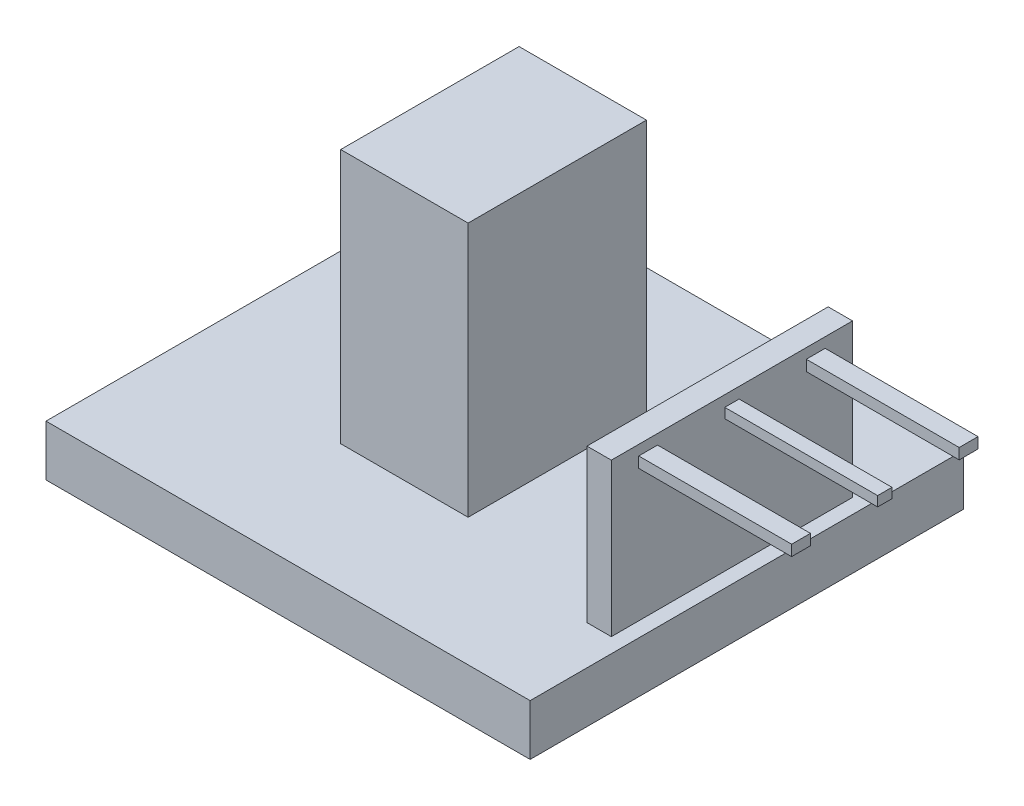
ISO-10303-21;
HEADER;
FILE_DESCRIPTION(('STEP AP214'),'2;1');
FILE_NAME('part.step','',(''),(''),'','','');
FILE_SCHEMA(('AUTOMOTIVE_DESIGN { 1 0 10303 214 1 1 1 1 }'));
ENDSEC;
DATA;
#1=APPLICATION_CONTEXT('core data for automotive mechanical design processes');
#2=APPLICATION_PROTOCOL_DEFINITION('international standard','automotive_design',2000,#1);
#3=PRODUCT_CONTEXT('',#1,'mechanical');
#4=PRODUCT('Part','Part','',(#3));
#5=PRODUCT_RELATED_PRODUCT_CATEGORY('part','',(#4));
#6=PRODUCT_DEFINITION_FORMATION('','',#4);
#7=PRODUCT_DEFINITION_CONTEXT('part definition',#1,'design');
#8=PRODUCT_DEFINITION('design','',#6,#7);
#9=PRODUCT_DEFINITION_SHAPE('','',#8);
#10=(LENGTH_UNIT() NAMED_UNIT(*) SI_UNIT(.MILLI.,.METRE.));
#11=(NAMED_UNIT(*) PLANE_ANGLE_UNIT() SI_UNIT($,.RADIAN.));
#12=(NAMED_UNIT(*) SI_UNIT($,.STERADIAN.) SOLID_ANGLE_UNIT());
#13=UNCERTAINTY_MEASURE_WITH_UNIT(LENGTH_MEASURE(1.E-05),#10,'distance_accuracy_value','');
#14=(GEOMETRIC_REPRESENTATION_CONTEXT(3) GLOBAL_UNCERTAINTY_ASSIGNED_CONTEXT((#13)) GLOBAL_UNIT_ASSIGNED_CONTEXT((#10,
#11,#12)) REPRESENTATION_CONTEXT('',''));
#15=CARTESIAN_POINT('',(0.,0.,0.));
#16=DIRECTION('',(0.,0.,1.));
#17=DIRECTION('',(1.,0.,0.));
#18=AXIS2_PLACEMENT_3D('',#15,#16,#17);
#19=CARTESIAN_POINT('',(0.,2.,0.));
#20=DIRECTION('',(0.,1.,0.));
#21=DIRECTION('',(0.,0.,1.));
#22=AXIS2_PLACEMENT_3D('',#19,#20,#21);
#23=PLANE('',#22);
#24=DIRECTION('',(0.,0.,-1.));
#25=VECTOR('',#24,1.);
#26=CARTESIAN_POINT('',(9.49999999999999,2.,-8.5));
#27=LINE('',#26,#25);
#28=CARTESIAN_POINT('',(9.49999999999999,2.,8.5));
#29=VERTEX_POINT('',#28);
#30=CARTESIAN_POINT('',(9.49999999999999,2.,-8.5));
#31=VERTEX_POINT('',#30);
#32=EDGE_CURVE('E354',#29,#31,#27,.T.);
#33=ORIENTED_EDGE('',*,*,#32,.T.);
#34=DIRECTION('',(-1.,0.,0.));
#35=VECTOR('',#34,1.);
#36=CARTESIAN_POINT('',(-9.50000000000001,2.,-8.5));
#37=LINE('',#36,#35);
#38=CARTESIAN_POINT('',(-9.50000000000001,2.,-8.5));
#39=VERTEX_POINT('',#38);
#40=EDGE_CURVE('E357',#31,#39,#37,.T.);
#41=ORIENTED_EDGE('',*,*,#40,.T.);
#42=DIRECTION('',(0.,0.,1.));
#43=VECTOR('',#42,1.);
#44=CARTESIAN_POINT('',(-9.50000000000001,2.,-8.5));
#45=LINE('',#44,#43);
#46=CARTESIAN_POINT('',(-9.50000000000001,2.,8.5));
#47=VERTEX_POINT('',#46);
#48=EDGE_CURVE('E360',#39,#47,#45,.T.);
#49=ORIENTED_EDGE('',*,*,#48,.T.);
#50=DIRECTION('',(1.,0.,0.));
#51=VECTOR('',#50,1.);
#52=CARTESIAN_POINT('',(-9.50000000000001,2.,8.5));
#53=LINE('',#52,#51);
#54=EDGE_CURVE('E362',#47,#29,#53,.T.);
#55=ORIENTED_EDGE('',*,*,#54,.T.);
#56=EDGE_LOOP('',(#33,#41,#49,#55));
#57=FACE_BOUND('',#56,.T.);
#58=DIRECTION('',(-1.,0.,0.));
#59=VECTOR('',#58,1.);
#60=CARTESIAN_POINT('',(7.96432451108709,2.,-4.73308428087461));
#61=LINE('',#60,#59);
#62=CARTESIAN_POINT('',(8.92004345241754,2.,-4.73308428087461));
#63=VERTEX_POINT('',#62);
#64=CARTESIAN_POINT('',(7.96432451108709,2.,-4.73308428087461));
#65=VERTEX_POINT('',#64);
#66=EDGE_CURVE('E338',#63,#65,#61,.T.);
#67=ORIENTED_EDGE('',*,*,#66,.F.);
#68=DIRECTION('',(0.,0.,-1.));
#69=VECTOR('',#68,1.);
#70=CARTESIAN_POINT('',(8.92004345241754,2.,-4.73308428087461));
#71=LINE('',#70,#69);
#72=CARTESIAN_POINT('',(8.92004345241754,2.,4.73308428087461));
#73=VERTEX_POINT('',#72);
#74=EDGE_CURVE('E324',#73,#63,#71,.T.);
#75=ORIENTED_EDGE('',*,*,#74,.F.);
#76=DIRECTION('',(1.,0.,0.));
#77=VECTOR('',#76,1.);
#78=CARTESIAN_POINT('',(7.96432451108709,2.,4.73308428087461));
#79=LINE('',#78,#77);
#80=CARTESIAN_POINT('',(7.96432451108709,2.,4.73308428087461));
#81=VERTEX_POINT('',#80);
#82=EDGE_CURVE('E329',#81,#73,#79,.T.);
#83=ORIENTED_EDGE('',*,*,#82,.F.);
#84=DIRECTION('',(0.,0.,1.));
#85=VECTOR('',#84,1.);
#86=CARTESIAN_POINT('',(7.96432451108709,2.,-4.73308428087461));
#87=LINE('',#86,#85);
#88=EDGE_CURVE('E340',#65,#81,#87,.T.);
#89=ORIENTED_EDGE('',*,*,#88,.F.);
#90=EDGE_LOOP('',(#67,#75,#83,#89));
#91=FACE_BOUND('',#90,.T.);
#92=DIRECTION('',(1.,0.,0.));
#93=VECTOR('',#92,1.);
#94=CARTESIAN_POINT('',(2.05215552606618,2.,3.48564971258784));
#95=LINE('',#94,#93);
#96=CARTESIAN_POINT('',(-2.94784447393382,2.,3.48564971258784));
#97=VERTEX_POINT('',#96);
#98=CARTESIAN_POINT('',(2.05215552606618,2.,3.48564971258784));
#99=VERTEX_POINT('',#98);
#100=EDGE_CURVE('E694',#97,#99,#95,.T.);
#101=ORIENTED_EDGE('',*,*,#100,.F.);
#102=DIRECTION('',(0.,0.,1.));
#103=VECTOR('',#102,1.);
#104=CARTESIAN_POINT('',(-2.94784447393382,2.,3.48564971258784));
#105=LINE('',#104,#103);
#106=CARTESIAN_POINT('',(-2.94784447393382,2.,-3.51435028741216));
#107=VERTEX_POINT('',#106);
#108=EDGE_CURVE('E222',#107,#97,#105,.T.);
#109=ORIENTED_EDGE('',*,*,#108,.F.);
#110=DIRECTION('',(-1.,0.,0.));
#111=VECTOR('',#110,1.);
#112=CARTESIAN_POINT('',(2.05215552606618,2.,-3.51435028741216));
#113=LINE('',#112,#111);
#114=CARTESIAN_POINT('',(2.05215552606618,2.,-3.51435028741216));
#115=VERTEX_POINT('',#114);
#116=EDGE_CURVE('E218',#115,#107,#113,.T.);
#117=ORIENTED_EDGE('',*,*,#116,.F.);
#118=DIRECTION('',(0.,0.,-1.));
#119=VECTOR('',#118,1.);
#120=CARTESIAN_POINT('',(2.05215552606618,2.,3.48564971258784));
#121=LINE('',#120,#119);
#122=EDGE_CURVE('E691',#99,#115,#121,.T.);
#123=ORIENTED_EDGE('',*,*,#122,.F.);
#124=EDGE_LOOP('',(#101,#109,#117,#123));
#125=FACE_BOUND('',#124,.T.);
#126=ADVANCED_FACE('F38',(#57,#91,#125),#23,.T.);
#127=CARTESIAN_POINT('',(8.92004345241754,8.,-4.73308428087461));
#128=DIRECTION('',(-1.,0.,0.));
#129=DIRECTION('',(0.,0.,1.));
#130=AXIS2_PLACEMENT_3D('',#127,#128,#129);
#131=PLANE('',#130);
#132=DIRECTION('',(0.,1.,0.));
#133=VECTOR('',#132,1.);
#134=CARTESIAN_POINT('',(8.92004345241754,7.60463258716091,2.91887321692049));
#135=LINE('',#134,#133);
#136=CARTESIAN_POINT('',(8.92004345241754,7.18262682085915,2.91887321692049));
#137=VERTEX_POINT('',#136);
#138=CARTESIAN_POINT('',(8.92004345241754,7.60463258716091,2.91887321692049));
#139=VERTEX_POINT('',#138);
#140=EDGE_CURVE('E291',#137,#139,#135,.T.);
#141=ORIENTED_EDGE('',*,*,#140,.F.);
#142=DIRECTION('',(0.,0.,-1.));
#143=VECTOR('',#142,1.);
#144=CARTESIAN_POINT('',(8.92004345241754,7.18262682085915,3.65738330794857));
#145=LINE('',#144,#143);
#146=CARTESIAN_POINT('',(8.92004345241754,7.18262682085915,3.65738330794857));
#147=VERTEX_POINT('',#146);
#148=EDGE_CURVE('E296',#147,#137,#145,.T.);
#149=ORIENTED_EDGE('',*,*,#148,.F.);
#150=DIRECTION('',(0.,-1.,0.));
#151=VECTOR('',#150,1.);
#152=CARTESIAN_POINT('',(8.92004345241754,7.60463258716091,3.65738330794857));
#153=LINE('',#152,#151);
#154=CARTESIAN_POINT('',(8.92004345241754,7.60463258716091,3.65738330794857));
#155=VERTEX_POINT('',#154);
#156=EDGE_CURVE('E308',#155,#147,#153,.T.);
#157=ORIENTED_EDGE('',*,*,#156,.F.);
#158=DIRECTION('',(0.,0.,1.));
#159=VECTOR('',#158,1.);
#160=CARTESIAN_POINT('',(8.92004345241754,7.60463258716091,3.65738330794857));
#161=LINE('',#160,#159);
#162=EDGE_CURVE('E305',#139,#155,#161,.T.);
#163=ORIENTED_EDGE('',*,*,#162,.F.);
#164=EDGE_LOOP('',(#141,#149,#157,#163));
#165=FACE_BOUND('',#164,.T.);
#166=ORIENTED_EDGE('',*,*,#74,.T.);
#167=DIRECTION('',(0.,-1.,0.));
#168=VECTOR('',#167,1.);
#169=CARTESIAN_POINT('',(8.92004345241754,8.,-4.73308428087461));
#170=LINE('',#169,#168);
#171=CARTESIAN_POINT('',(8.92004345241754,8.,-4.73308428087461));
#172=VERTEX_POINT('',#171);
#173=EDGE_CURVE('E351',#172,#63,#170,.T.);
#174=ORIENTED_EDGE('',*,*,#173,.F.);
#175=DIRECTION('',(0.,0.,-1.));
#176=VECTOR('',#175,1.);
#177=CARTESIAN_POINT('',(8.92004345241754,8.,-4.73308428087461));
#178=LINE('',#177,#176);
#179=CARTESIAN_POINT('',(8.92004345241754,8.,4.73308428087461));
#180=VERTEX_POINT('',#179);
#181=EDGE_CURVE('E325',#180,#172,#178,.T.);
#182=ORIENTED_EDGE('',*,*,#181,.F.);
#183=DIRECTION('',(0.,-1.,0.));
#184=VECTOR('',#183,1.);
#185=CARTESIAN_POINT('',(8.92004345241754,8.,4.73308428087461));
#186=LINE('',#185,#184);
#187=EDGE_CURVE('E335',#180,#73,#186,.T.);
#188=ORIENTED_EDGE('',*,*,#187,.T.);
#189=EDGE_LOOP('',(#166,#174,#182,#188));
#190=FACE_BOUND('',#189,.T.);
#191=DIRECTION('',(0.,0.,1.));
#192=VECTOR('',#191,1.);
#193=CARTESIAN_POINT('',(8.92004345241754,7.18262682085915,-3.65738330794857));
#194=LINE('',#193,#192);
#195=CARTESIAN_POINT('',(8.92004345241754,7.18262682085915,-3.65738330794857));
#196=VERTEX_POINT('',#195);
#197=CARTESIAN_POINT('',(8.92004345241754,7.18262682085915,-2.91887321692049));
#198=VERTEX_POINT('',#197);
#199=EDGE_CURVE('E275',#196,#198,#194,.T.);
#200=ORIENTED_EDGE('',*,*,#199,.T.);
#201=DIRECTION('',(0.,1.,0.));
#202=VECTOR('',#201,1.);
#203=CARTESIAN_POINT('',(8.92004345241754,7.60463258716091,-2.91887321692049));
#204=LINE('',#203,#202);
#205=CARTESIAN_POINT('',(8.92004345241754,7.60463258716091,-2.91887321692049));
#206=VERTEX_POINT('',#205);
#207=EDGE_CURVE('E258',#198,#206,#204,.T.);
#208=ORIENTED_EDGE('',*,*,#207,.T.);
#209=DIRECTION('',(0.,0.,-1.));
#210=VECTOR('',#209,1.);
#211=CARTESIAN_POINT('',(8.92004345241754,7.60463258716091,-3.65738330794857));
#212=LINE('',#211,#210);
#213=CARTESIAN_POINT('',(8.92004345241754,7.60463258716091,-3.65738330794857));
#214=VERTEX_POINT('',#213);
#215=EDGE_CURVE('E263',#206,#214,#212,.T.);
#216=ORIENTED_EDGE('',*,*,#215,.T.);
#217=DIRECTION('',(0.,-1.,0.));
#218=VECTOR('',#217,1.);
#219=CARTESIAN_POINT('',(8.92004345241754,7.60463258716091,-3.65738330794857));
#220=LINE('',#219,#218);
#221=EDGE_CURVE('E278',#214,#196,#220,.T.);
#222=ORIENTED_EDGE('',*,*,#221,.T.);
#223=EDGE_LOOP('',(#200,#208,#216,#222));
#224=FACE_BOUND('',#223,.T.);
#225=DIRECTION('',(0.,1.,0.));
#226=VECTOR('',#225,1.);
#227=CARTESIAN_POINT('',(8.92004345241754,7.56946543996908,-0.281337177534507));
#228=LINE('',#227,#226);
#229=CARTESIAN_POINT('',(8.92004345241754,7.18262682085914,-0.281337177534507));
#230=VERTEX_POINT('',#229);
#231=CARTESIAN_POINT('',(8.92004345241754,7.56946543996908,-0.281337177534507));
#232=VERTEX_POINT('',#231);
#233=EDGE_CURVE('E224',#230,#232,#228,.T.);
#234=ORIENTED_EDGE('',*,*,#233,.F.);
#235=DIRECTION('',(0.,0.,-1.));
#236=VECTOR('',#235,1.);
#237=CARTESIAN_POINT('',(8.92004345241754,7.18262682085914,0.281337177534507));
#238=LINE('',#237,#236);
#239=CARTESIAN_POINT('',(8.92004345241754,7.18262682085914,0.281337177534507));
#240=VERTEX_POINT('',#239);
#241=EDGE_CURVE('E235',#240,#230,#238,.T.);
#242=ORIENTED_EDGE('',*,*,#241,.F.);
#243=DIRECTION('',(0.,-1.,0.));
#244=VECTOR('',#243,1.);
#245=CARTESIAN_POINT('',(8.92004345241754,7.56946543996908,0.281337177534507));
#246=LINE('',#245,#244);
#247=CARTESIAN_POINT('',(8.92004345241754,7.56946543996908,0.281337177534507));
#248=VERTEX_POINT('',#247);
#249=EDGE_CURVE('E243',#248,#240,#246,.T.);
#250=ORIENTED_EDGE('',*,*,#249,.F.);
#251=DIRECTION('',(0.,0.,1.));
#252=VECTOR('',#251,1.);
#253=CARTESIAN_POINT('',(8.92004345241754,7.56946543996908,0.281337177534507));
#254=LINE('',#253,#252);
#255=EDGE_CURVE('E61',#232,#248,#254,.T.);
#256=ORIENTED_EDGE('',*,*,#255,.F.);
#257=EDGE_LOOP('',(#234,#242,#250,#256));
#258=FACE_BOUND('',#257,.T.);
#259=ADVANCED_FACE('F404',(#165,#190,#224,#258),#131,.F.);
#260=CARTESIAN_POINT('',(9.49999999999999,2.,-8.5));
#261=DIRECTION('',(-1.,0.,0.));
#262=DIRECTION('',(0.,0.,1.));
#263=AXIS2_PLACEMENT_3D('',#260,#261,#262);
#264=PLANE('',#263);
#265=DIRECTION('',(0.,0.,-1.));
#266=VECTOR('',#265,1.);
#267=CARTESIAN_POINT('',(9.49999999999999,0.,-8.5));
#268=LINE('',#267,#266);
#269=CARTESIAN_POINT('',(9.49999999999999,0.,8.5));
#270=VERTEX_POINT('',#269);
#271=CARTESIAN_POINT('',(9.49999999999999,0.,-8.5));
#272=VERTEX_POINT('',#271);
#273=EDGE_CURVE('E353',#270,#272,#268,.T.);
#274=ORIENTED_EDGE('',*,*,#273,.T.);
#275=DIRECTION('',(0.,-1.,0.));
#276=VECTOR('',#275,1.);
#277=CARTESIAN_POINT('',(9.49999999999999,2.,-8.5));
#278=LINE('',#277,#276);
#279=EDGE_CURVE('E11',#31,#272,#278,.T.);
#280=ORIENTED_EDGE('',*,*,#279,.F.);
#281=ORIENTED_EDGE('',*,*,#32,.F.);
#282=DIRECTION('',(0.,-1.,0.));
#283=VECTOR('',#282,1.);
#284=CARTESIAN_POINT('',(9.49999999999999,2.,8.5));
#285=LINE('',#284,#283);
#286=EDGE_CURVE('E364',#29,#270,#285,.T.);
#287=ORIENTED_EDGE('',*,*,#286,.T.);
#288=EDGE_LOOP('',(#274,#280,#281,#287));
#289=FACE_BOUND('',#288,.T.);
#290=ADVANCED_FACE('F40',(#289),#264,.F.);
#291=CARTESIAN_POINT('',(-9.50000000000001,2.,-8.5));
#292=DIRECTION('',(0.,0.,1.));
#293=DIRECTION('',(1.,0.,0.));
#294=AXIS2_PLACEMENT_3D('',#291,#292,#293);
#295=PLANE('',#294);
#296=DIRECTION('',(-1.,0.,0.));
#297=VECTOR('',#296,1.);
#298=CARTESIAN_POINT('',(-9.50000000000001,0.,-8.5));
#299=LINE('',#298,#297);
#300=CARTESIAN_POINT('',(-9.50000000000001,0.,-8.5));
#301=VERTEX_POINT('',#300);
#302=EDGE_CURVE('E367',#272,#301,#299,.T.);
#303=ORIENTED_EDGE('',*,*,#302,.T.);
#304=DIRECTION('',(0.,-1.,0.));
#305=VECTOR('',#304,1.);
#306=CARTESIAN_POINT('',(-9.50000000000001,2.,-8.5));
#307=LINE('',#306,#305);
#308=EDGE_CURVE('E46',#39,#301,#307,.T.);
#309=ORIENTED_EDGE('',*,*,#308,.F.);
#310=ORIENTED_EDGE('',*,*,#40,.F.);
#311=ORIENTED_EDGE('',*,*,#279,.T.);
#312=EDGE_LOOP('',(#303,#309,#310,#311));
#313=FACE_BOUND('',#312,.T.);
#314=ADVANCED_FACE('F397',(#313),#295,.F.);
#315=CARTESIAN_POINT('',(-9.50000000000001,2.,-8.5));
#316=DIRECTION('',(1.,0.,0.));
#317=DIRECTION('',(0.,0.,-1.));
#318=AXIS2_PLACEMENT_3D('',#315,#316,#317);
#319=PLANE('',#318);
#320=DIRECTION('',(0.,0.,1.));
#321=VECTOR('',#320,1.);
#322=CARTESIAN_POINT('',(-9.50000000000001,0.,-8.5));
#323=LINE('',#322,#321);
#324=CARTESIAN_POINT('',(-9.50000000000001,0.,8.5));
#325=VERTEX_POINT('',#324);
#326=EDGE_CURVE('E369',#301,#325,#323,.T.);
#327=ORIENTED_EDGE('',*,*,#326,.T.);
#328=DIRECTION('',(0.,-1.,0.));
#329=VECTOR('',#328,1.);
#330=CARTESIAN_POINT('',(-9.50000000000001,2.,8.5));
#331=LINE('',#330,#329);
#332=EDGE_CURVE('E374',#47,#325,#331,.T.);
#333=ORIENTED_EDGE('',*,*,#332,.F.);
#334=ORIENTED_EDGE('',*,*,#48,.F.);
#335=ORIENTED_EDGE('',*,*,#308,.T.);
#336=EDGE_LOOP('',(#327,#333,#334,#335));
#337=FACE_BOUND('',#336,.T.);
#338=ADVANCED_FACE('F381',(#337),#319,.F.);
#339=CARTESIAN_POINT('',(-9.50000000000001,2.,8.5));
#340=DIRECTION('',(0.,0.,-1.));
#341=DIRECTION('',(-1.,0.,0.));
#342=AXIS2_PLACEMENT_3D('',#339,#340,#341);
#343=PLANE('',#342);
#344=DIRECTION('',(1.,0.,0.));
#345=VECTOR('',#344,1.);
#346=CARTESIAN_POINT('',(-9.50000000000001,0.,8.5));
#347=LINE('',#346,#345);
#348=EDGE_CURVE('E358',#325,#270,#347,.T.);
#349=ORIENTED_EDGE('',*,*,#348,.T.);
#350=ORIENTED_EDGE('',*,*,#286,.F.);
#351=ORIENTED_EDGE('',*,*,#54,.F.);
#352=ORIENTED_EDGE('',*,*,#332,.T.);
#353=EDGE_LOOP('',(#349,#350,#351,#352));
#354=FACE_BOUND('',#353,.T.);
#355=ADVANCED_FACE('F390',(#354),#343,.F.);
#356=CARTESIAN_POINT('',(0.,0.,0.));
#357=DIRECTION('',(0.,1.,0.));
#358=DIRECTION('',(0.,0.,1.));
#359=AXIS2_PLACEMENT_3D('',#356,#357,#358);
#360=PLANE('',#359);
#361=ORIENTED_EDGE('',*,*,#273,.F.);
#362=ORIENTED_EDGE('',*,*,#348,.F.);
#363=ORIENTED_EDGE('',*,*,#326,.F.);
#364=ORIENTED_EDGE('',*,*,#302,.F.);
#365=EDGE_LOOP('',(#361,#362,#363,#364));
#366=FACE_BOUND('',#365,.T.);
#367=ADVANCED_FACE('F387',(#366),#360,.F.);
#368=CARTESIAN_POINT('',(7.96432451108709,8.,-4.73308428087461));
#369=DIRECTION('',(0.,0.,1.));
#370=DIRECTION('',(1.,0.,0.));
#371=AXIS2_PLACEMENT_3D('',#368,#369,#370);
#372=PLANE('',#371);
#373=ORIENTED_EDGE('',*,*,#66,.T.);
#374=DIRECTION('',(0.,-1.,0.));
#375=VECTOR('',#374,1.);
#376=CARTESIAN_POINT('',(7.96432451108709,8.,-4.73308428087461));
#377=LINE('',#376,#375);
#378=CARTESIAN_POINT('',(7.96432451108709,8.,-4.73308428087461));
#379=VERTEX_POINT('',#378);
#380=EDGE_CURVE('E348',#379,#65,#377,.T.);
#381=ORIENTED_EDGE('',*,*,#380,.F.);
#382=DIRECTION('',(-1.,0.,0.));
#383=VECTOR('',#382,1.);
#384=CARTESIAN_POINT('',(7.96432451108709,8.,-4.73308428087461));
#385=LINE('',#384,#383);
#386=EDGE_CURVE('E328',#172,#379,#385,.T.);
#387=ORIENTED_EDGE('',*,*,#386,.F.);
#388=ORIENTED_EDGE('',*,*,#173,.T.);
#389=EDGE_LOOP('',(#373,#381,#387,#388));
#390=FACE_BOUND('',#389,.T.);
#391=ADVANCED_FACE('F416',(#390),#372,.F.);
#392=CARTESIAN_POINT('',(7.96432451108709,8.,-4.73308428087461));
#393=DIRECTION('',(1.,0.,0.));
#394=DIRECTION('',(0.,0.,-1.));
#395=AXIS2_PLACEMENT_3D('',#392,#393,#394);
#396=PLANE('',#395);
#397=ORIENTED_EDGE('',*,*,#88,.T.);
#398=DIRECTION('',(0.,-1.,0.));
#399=VECTOR('',#398,1.);
#400=CARTESIAN_POINT('',(7.96432451108709,8.,4.73308428087461));
#401=LINE('',#400,#399);
#402=CARTESIAN_POINT('',(7.96432451108709,8.,4.73308428087461));
#403=VERTEX_POINT('',#402);
#404=EDGE_CURVE('E346',#403,#81,#401,.T.);
#405=ORIENTED_EDGE('',*,*,#404,.F.);
#406=DIRECTION('',(0.,0.,1.));
#407=VECTOR('',#406,1.);
#408=CARTESIAN_POINT('',(7.96432451108709,8.,-4.73308428087461));
#409=LINE('',#408,#407);
#410=EDGE_CURVE('E331',#379,#403,#409,.T.);
#411=ORIENTED_EDGE('',*,*,#410,.F.);
#412=ORIENTED_EDGE('',*,*,#380,.T.);
#413=EDGE_LOOP('',(#397,#405,#411,#412));
#414=FACE_BOUND('',#413,.T.);
#415=ADVANCED_FACE('F432',(#414),#396,.F.);
#416=CARTESIAN_POINT('',(7.96432451108709,8.,4.73308428087461));
#417=DIRECTION('',(0.,0.,-1.));
#418=DIRECTION('',(-1.,0.,0.));
#419=AXIS2_PLACEMENT_3D('',#416,#417,#418);
#420=PLANE('',#419);
#421=ORIENTED_EDGE('',*,*,#82,.T.);
#422=ORIENTED_EDGE('',*,*,#187,.F.);
#423=DIRECTION('',(1.,0.,0.));
#424=VECTOR('',#423,1.);
#425=CARTESIAN_POINT('',(7.96432451108709,8.,4.73308428087461));
#426=LINE('',#425,#424);
#427=EDGE_CURVE('E333',#403,#180,#426,.T.);
#428=ORIENTED_EDGE('',*,*,#427,.F.);
#429=ORIENTED_EDGE('',*,*,#404,.T.);
#430=EDGE_LOOP('',(#421,#422,#428,#429));
#431=FACE_BOUND('',#430,.T.);
#432=ADVANCED_FACE('F439',(#431),#420,.F.);
#433=CARTESIAN_POINT('',(0.,8.,0.));
#434=DIRECTION('',(0.,1.,0.));
#435=DIRECTION('',(0.,0.,1.));
#436=AXIS2_PLACEMENT_3D('',#433,#434,#435);
#437=PLANE('',#436);
#438=ORIENTED_EDGE('',*,*,#181,.T.);
#439=ORIENTED_EDGE('',*,*,#386,.T.);
#440=ORIENTED_EDGE('',*,*,#410,.T.);
#441=ORIENTED_EDGE('',*,*,#427,.T.);
#442=EDGE_LOOP('',(#438,#439,#440,#441));
#443=FACE_BOUND('',#442,.T.);
#444=ADVANCED_FACE('F447',(#443),#437,.T.);
#445=CARTESIAN_POINT('',(14.9200434524175,7.60463258716091,2.91887321692049));
#446=DIRECTION('',(0.,0.,1.));
#447=DIRECTION('',(1.,0.,0.));
#448=AXIS2_PLACEMENT_3D('',#445,#446,#447);
#449=PLANE('',#448);
#450=ORIENTED_EDGE('',*,*,#140,.T.);
#451=DIRECTION('',(-1.,0.,0.));
#452=VECTOR('',#451,1.);
#453=CARTESIAN_POINT('',(14.9200434524175,7.60463258716091,2.91887321692049));
#454=LINE('',#453,#452);
#455=CARTESIAN_POINT('',(14.9200434524175,7.60463258716091,2.91887321692049));
#456=VERTEX_POINT('',#455);
#457=EDGE_CURVE('E321',#456,#139,#454,.T.);
#458=ORIENTED_EDGE('',*,*,#457,.F.);
#459=DIRECTION('',(0.,1.,0.));
#460=VECTOR('',#459,1.);
#461=CARTESIAN_POINT('',(14.9200434524175,7.60463258716091,2.91887321692049));
#462=LINE('',#461,#460);
#463=CARTESIAN_POINT('',(14.9200434524175,7.18262682085915,2.91887321692049));
#464=VERTEX_POINT('',#463);
#465=EDGE_CURVE('E292',#464,#456,#462,.T.);
#466=ORIENTED_EDGE('',*,*,#465,.F.);
#467=DIRECTION('',(-1.,0.,0.));
#468=VECTOR('',#467,1.);
#469=CARTESIAN_POINT('',(14.9200434524175,7.18262682085915,2.91887321692049));
#470=LINE('',#469,#468);
#471=EDGE_CURVE('E302',#464,#137,#470,.T.);
#472=ORIENTED_EDGE('',*,*,#471,.T.);
#473=EDGE_LOOP('',(#450,#458,#466,#472));
#474=FACE_BOUND('',#473,.T.);
#475=ADVANCED_FACE('F455',(#474),#449,.F.);
#476=CARTESIAN_POINT('',(14.9200434524175,7.60463258716091,3.65738330794857));
#477=DIRECTION('',(0.,-1.,0.));
#478=DIRECTION('',(0.,0.,-1.));
#479=AXIS2_PLACEMENT_3D('',#476,#477,#478);
#480=PLANE('',#479);
#481=ORIENTED_EDGE('',*,*,#162,.T.);
#482=DIRECTION('',(-1.,0.,0.));
#483=VECTOR('',#482,1.);
#484=CARTESIAN_POINT('',(14.9200434524175,7.60463258716091,3.65738330794857));
#485=LINE('',#484,#483);
#486=CARTESIAN_POINT('',(14.9200434524175,7.60463258716091,3.65738330794857));
#487=VERTEX_POINT('',#486);
#488=EDGE_CURVE('E318',#487,#155,#485,.T.);
#489=ORIENTED_EDGE('',*,*,#488,.F.);
#490=DIRECTION('',(0.,0.,1.));
#491=VECTOR('',#490,1.);
#492=CARTESIAN_POINT('',(14.9200434524175,7.60463258716091,3.65738330794857));
#493=LINE('',#492,#491);
#494=EDGE_CURVE('E295',#456,#487,#493,.T.);
#495=ORIENTED_EDGE('',*,*,#494,.F.);
#496=ORIENTED_EDGE('',*,*,#457,.T.);
#497=EDGE_LOOP('',(#481,#489,#495,#496));
#498=FACE_BOUND('',#497,.T.);
#499=ADVANCED_FACE('F463',(#498),#480,.F.);
#500=CARTESIAN_POINT('',(14.9200434524175,7.60463258716091,3.65738330794857));
#501=DIRECTION('',(0.,0.,-1.));
#502=DIRECTION('',(-1.,0.,0.));
#503=AXIS2_PLACEMENT_3D('',#500,#501,#502);
#504=PLANE('',#503);
#505=ORIENTED_EDGE('',*,*,#156,.T.);
#506=DIRECTION('',(-1.,0.,0.));
#507=VECTOR('',#506,1.);
#508=CARTESIAN_POINT('',(14.9200434524175,7.18262682085915,3.65738330794857));
#509=LINE('',#508,#507);
#510=CARTESIAN_POINT('',(14.9200434524175,7.18262682085915,3.65738330794857));
#511=VERTEX_POINT('',#510);
#512=EDGE_CURVE('E315',#511,#147,#509,.T.);
#513=ORIENTED_EDGE('',*,*,#512,.F.);
#514=DIRECTION('',(0.,-1.,0.));
#515=VECTOR('',#514,1.);
#516=CARTESIAN_POINT('',(14.9200434524175,7.60463258716091,3.65738330794857));
#517=LINE('',#516,#515);
#518=EDGE_CURVE('E298',#487,#511,#517,.T.);
#519=ORIENTED_EDGE('',*,*,#518,.F.);
#520=ORIENTED_EDGE('',*,*,#488,.T.);
#521=EDGE_LOOP('',(#505,#513,#519,#520));
#522=FACE_BOUND('',#521,.T.);
#523=ADVANCED_FACE('F471',(#522),#504,.F.);
#524=CARTESIAN_POINT('',(14.9200434524175,7.18262682085915,3.65738330794857));
#525=DIRECTION('',(0.,1.,0.));
#526=DIRECTION('',(0.,0.,1.));
#527=AXIS2_PLACEMENT_3D('',#524,#525,#526);
#528=PLANE('',#527);
#529=ORIENTED_EDGE('',*,*,#148,.T.);
#530=ORIENTED_EDGE('',*,*,#471,.F.);
#531=DIRECTION('',(0.,0.,-1.));
#532=VECTOR('',#531,1.);
#533=CARTESIAN_POINT('',(14.9200434524175,7.18262682085915,3.65738330794857));
#534=LINE('',#533,#532);
#535=EDGE_CURVE('E300',#511,#464,#534,.T.);
#536=ORIENTED_EDGE('',*,*,#535,.F.);
#537=ORIENTED_EDGE('',*,*,#512,.T.);
#538=EDGE_LOOP('',(#529,#530,#536,#537));
#539=FACE_BOUND('',#538,.T.);
#540=ADVANCED_FACE('F479',(#539),#528,.F.);
#541=CARTESIAN_POINT('',(14.9200434524175,0.,0.));
#542=DIRECTION('',(1.,0.,0.));
#543=DIRECTION('',(0.,0.,-1.));
#544=AXIS2_PLACEMENT_3D('',#541,#542,#543);
#545=PLANE('',#544);
#546=ORIENTED_EDGE('',*,*,#465,.T.);
#547=ORIENTED_EDGE('',*,*,#494,.T.);
#548=ORIENTED_EDGE('',*,*,#518,.T.);
#549=ORIENTED_EDGE('',*,*,#535,.T.);
#550=EDGE_LOOP('',(#546,#547,#548,#549));
#551=FACE_BOUND('',#550,.T.);
#552=ADVANCED_FACE('F487',(#551),#545,.T.);
#553=CARTESIAN_POINT('',(14.9200434524175,7.60463258716091,-2.91887321692049));
#554=DIRECTION('',(0.,0.,1.));
#555=DIRECTION('',(1.,0.,0.));
#556=AXIS2_PLACEMENT_3D('',#553,#554,#555);
#557=PLANE('',#556);
#558=ORIENTED_EDGE('',*,*,#207,.F.);
#559=DIRECTION('',(-1.,0.,0.));
#560=VECTOR('',#559,1.);
#561=CARTESIAN_POINT('',(14.9200434524175,7.18262682085915,-2.91887321692049));
#562=LINE('',#561,#560);
#563=CARTESIAN_POINT('',(14.9200434524175,7.18262682085915,-2.91887321692049));
#564=VERTEX_POINT('',#563);
#565=EDGE_CURVE('E289',#564,#198,#562,.T.);
#566=ORIENTED_EDGE('',*,*,#565,.F.);
#567=DIRECTION('',(0.,1.,0.));
#568=VECTOR('',#567,1.);
#569=CARTESIAN_POINT('',(14.9200434524175,7.60463258716091,-2.91887321692049));
#570=LINE('',#569,#568);
#571=CARTESIAN_POINT('',(14.9200434524175,7.60463258716091,-2.91887321692049));
#572=VERTEX_POINT('',#571);
#573=EDGE_CURVE('E259',#564,#572,#570,.T.);
#574=ORIENTED_EDGE('',*,*,#573,.T.);
#575=DIRECTION('',(-1.,0.,0.));
#576=VECTOR('',#575,1.);
#577=CARTESIAN_POINT('',(14.9200434524175,7.60463258716091,-2.91887321692049));
#578=LINE('',#577,#576);
#579=EDGE_CURVE('E272',#572,#206,#578,.T.);
#580=ORIENTED_EDGE('',*,*,#579,.T.);
#581=EDGE_LOOP('',(#558,#566,#574,#580));
#582=FACE_BOUND('',#581,.T.);
#583=ADVANCED_FACE('F495',(#582),#557,.T.);
#584=CARTESIAN_POINT('',(14.9200434524175,7.18262682085915,-3.65738330794857));
#585=DIRECTION('',(0.,-1.,0.));
#586=DIRECTION('',(0.,0.,-1.));
#587=AXIS2_PLACEMENT_3D('',#584,#585,#586);
#588=PLANE('',#587);
#589=ORIENTED_EDGE('',*,*,#199,.F.);
#590=DIRECTION('',(-1.,0.,0.));
#591=VECTOR('',#590,1.);
#592=CARTESIAN_POINT('',(14.9200434524175,7.18262682085915,-3.65738330794857));
#593=LINE('',#592,#591);
#594=CARTESIAN_POINT('',(14.9200434524175,7.18262682085915,-3.65738330794857));
#595=VERTEX_POINT('',#594);
#596=EDGE_CURVE('E287',#595,#196,#593,.T.);
#597=ORIENTED_EDGE('',*,*,#596,.F.);
#598=DIRECTION('',(0.,0.,1.));
#599=VECTOR('',#598,1.);
#600=CARTESIAN_POINT('',(14.9200434524175,7.18262682085915,-3.65738330794857));
#601=LINE('',#600,#599);
#602=EDGE_CURVE('E262',#595,#564,#601,.T.);
#603=ORIENTED_EDGE('',*,*,#602,.T.);
#604=ORIENTED_EDGE('',*,*,#565,.T.);
#605=EDGE_LOOP('',(#589,#597,#603,#604));
#606=FACE_BOUND('',#605,.T.);
#607=ADVANCED_FACE('F503',(#606),#588,.T.);
#608=CARTESIAN_POINT('',(14.9200434524175,7.60463258716091,-3.65738330794857));
#609=DIRECTION('',(0.,0.,-1.));
#610=DIRECTION('',(-1.,0.,0.));
#611=AXIS2_PLACEMENT_3D('',#608,#609,#610);
#612=PLANE('',#611);
#613=ORIENTED_EDGE('',*,*,#221,.F.);
#614=DIRECTION('',(-1.,0.,0.));
#615=VECTOR('',#614,1.);
#616=CARTESIAN_POINT('',(14.9200434524175,7.60463258716091,-3.65738330794857));
#617=LINE('',#616,#615);
#618=CARTESIAN_POINT('',(14.9200434524175,7.60463258716091,-3.65738330794857));
#619=VERTEX_POINT('',#618);
#620=EDGE_CURVE('E284',#619,#214,#617,.T.);
#621=ORIENTED_EDGE('',*,*,#620,.F.);
#622=DIRECTION('',(0.,-1.,0.));
#623=VECTOR('',#622,1.);
#624=CARTESIAN_POINT('',(14.9200434524175,7.60463258716091,-3.65738330794857));
#625=LINE('',#624,#623);
#626=EDGE_CURVE('E266',#619,#595,#625,.T.);
#627=ORIENTED_EDGE('',*,*,#626,.T.);
#628=ORIENTED_EDGE('',*,*,#596,.T.);
#629=EDGE_LOOP('',(#613,#621,#627,#628));
#630=FACE_BOUND('',#629,.T.);
#631=ADVANCED_FACE('F511',(#630),#612,.T.);
#632=CARTESIAN_POINT('',(14.9200434524175,7.60463258716091,-3.65738330794857));
#633=DIRECTION('',(0.,1.,0.));
#634=DIRECTION('',(0.,0.,1.));
#635=AXIS2_PLACEMENT_3D('',#632,#633,#634);
#636=PLANE('',#635);
#637=ORIENTED_EDGE('',*,*,#215,.F.);
#638=ORIENTED_EDGE('',*,*,#579,.F.);
#639=DIRECTION('',(0.,0.,-1.));
#640=VECTOR('',#639,1.);
#641=CARTESIAN_POINT('',(14.9200434524175,7.60463258716091,-3.65738330794857));
#642=LINE('',#641,#640);
#643=EDGE_CURVE('E269',#572,#619,#642,.T.);
#644=ORIENTED_EDGE('',*,*,#643,.T.);
#645=ORIENTED_EDGE('',*,*,#620,.T.);
#646=EDGE_LOOP('',(#637,#638,#644,#645));
#647=FACE_BOUND('',#646,.T.);
#648=ADVANCED_FACE('F519',(#647),#636,.T.);
#649=CARTESIAN_POINT('',(14.9200434524175,0.,0.));
#650=DIRECTION('',(1.,0.,0.));
#651=DIRECTION('',(0.,0.,1.));
#652=AXIS2_PLACEMENT_3D('',#649,#650,#651);
#653=PLANE('',#652);
#654=ORIENTED_EDGE('',*,*,#573,.F.);
#655=ORIENTED_EDGE('',*,*,#602,.F.);
#656=ORIENTED_EDGE('',*,*,#626,.F.);
#657=ORIENTED_EDGE('',*,*,#643,.F.);
#658=EDGE_LOOP('',(#654,#655,#656,#657));
#659=FACE_BOUND('',#658,.T.);
#660=ADVANCED_FACE('F527',(#659),#653,.T.);
#661=CARTESIAN_POINT('',(14.9200434524175,7.56946543996908,-0.281337177534507));
#662=DIRECTION('',(0.,0.,1.));
#663=DIRECTION('',(1.,0.,0.));
#664=AXIS2_PLACEMENT_3D('',#661,#662,#663);
#665=PLANE('',#664);
#666=ORIENTED_EDGE('',*,*,#233,.T.);
#667=DIRECTION('',(-1.,0.,0.));
#668=VECTOR('',#667,1.);
#669=CARTESIAN_POINT('',(14.9200434524175,7.56946543996908,-0.281337177534507));
#670=LINE('',#669,#668);
#671=CARTESIAN_POINT('',(14.9200434524175,7.56946543996908,-0.281337177534507));
#672=VERTEX_POINT('',#671);
#673=EDGE_CURVE('E256',#672,#232,#670,.T.);
#674=ORIENTED_EDGE('',*,*,#673,.F.);
#675=DIRECTION('',(0.,1.,0.));
#676=VECTOR('',#675,1.);
#677=CARTESIAN_POINT('',(14.9200434524175,7.56946543996908,-0.281337177534507));
#678=LINE('',#677,#676);
#679=CARTESIAN_POINT('',(14.9200434524175,7.18262682085914,-0.281337177534507));
#680=VERTEX_POINT('',#679);
#681=EDGE_CURVE('E231',#680,#672,#678,.T.);
#682=ORIENTED_EDGE('',*,*,#681,.F.);
#683=DIRECTION('',(-1.,0.,0.));
#684=VECTOR('',#683,1.);
#685=CARTESIAN_POINT('',(14.9200434524175,7.18262682085914,-0.281337177534507));
#686=LINE('',#685,#684);
#687=EDGE_CURVE('E240',#680,#230,#686,.T.);
#688=ORIENTED_EDGE('',*,*,#687,.T.);
#689=EDGE_LOOP('',(#666,#674,#682,#688));
#690=FACE_BOUND('',#689,.T.);
#691=ADVANCED_FACE('F535',(#690),#665,.F.);
#692=CARTESIAN_POINT('',(14.9200434524175,7.56946543996908,0.281337177534507));
#693=DIRECTION('',(0.,-1.,0.));
#694=DIRECTION('',(0.,0.,-1.));
#695=AXIS2_PLACEMENT_3D('',#692,#693,#694);
#696=PLANE('',#695);
#697=ORIENTED_EDGE('',*,*,#255,.T.);
#698=DIRECTION('',(-1.,0.,0.));
#699=VECTOR('',#698,1.);
#700=CARTESIAN_POINT('',(14.9200434524175,7.56946543996908,0.281337177534507));
#701=LINE('',#700,#699);
#702=CARTESIAN_POINT('',(14.9200434524175,7.56946543996908,0.281337177534507));
#703=VERTEX_POINT('',#702);
#704=EDGE_CURVE('E253',#703,#248,#701,.T.);
#705=ORIENTED_EDGE('',*,*,#704,.F.);
#706=DIRECTION('',(0.,0.,1.));
#707=VECTOR('',#706,1.);
#708=CARTESIAN_POINT('',(14.9200434524175,7.56946543996908,0.281337177534507));
#709=LINE('',#708,#707);
#710=EDGE_CURVE('E234',#672,#703,#709,.T.);
#711=ORIENTED_EDGE('',*,*,#710,.F.);
#712=ORIENTED_EDGE('',*,*,#673,.T.);
#713=EDGE_LOOP('',(#697,#705,#711,#712));
#714=FACE_BOUND('',#713,.T.);
#715=ADVANCED_FACE('F544',(#714),#696,.F.);
#716=CARTESIAN_POINT('',(14.9200434524175,7.56946543996908,0.281337177534507));
#717=DIRECTION('',(0.,0.,-1.));
#718=DIRECTION('',(-1.,0.,0.));
#719=AXIS2_PLACEMENT_3D('',#716,#717,#718);
#720=PLANE('',#719);
#721=ORIENTED_EDGE('',*,*,#249,.T.);
#722=DIRECTION('',(-1.,0.,0.));
#723=VECTOR('',#722,1.);
#724=CARTESIAN_POINT('',(14.9200434524175,7.18262682085914,0.281337177534507));
#725=LINE('',#724,#723);
#726=CARTESIAN_POINT('',(14.9200434524175,7.18262682085914,0.281337177534507));
#727=VERTEX_POINT('',#726);
#728=EDGE_CURVE('E250',#727,#240,#725,.T.);
#729=ORIENTED_EDGE('',*,*,#728,.F.);
#730=DIRECTION('',(0.,-1.,0.));
#731=VECTOR('',#730,1.);
#732=CARTESIAN_POINT('',(14.9200434524175,7.56946543996908,0.281337177534507));
#733=LINE('',#732,#731);
#734=EDGE_CURVE('E237',#703,#727,#733,.T.);
#735=ORIENTED_EDGE('',*,*,#734,.F.);
#736=ORIENTED_EDGE('',*,*,#704,.T.);
#737=EDGE_LOOP('',(#721,#729,#735,#736));
#738=FACE_BOUND('',#737,.T.);
#739=ADVANCED_FACE('F552',(#738),#720,.F.);
#740=CARTESIAN_POINT('',(14.9200434524175,7.18262682085914,0.281337177534507));
#741=DIRECTION('',(0.,1.,0.));
#742=DIRECTION('',(0.,0.,1.));
#743=AXIS2_PLACEMENT_3D('',#740,#741,#742);
#744=PLANE('',#743);
#745=ORIENTED_EDGE('',*,*,#241,.T.);
#746=ORIENTED_EDGE('',*,*,#687,.F.);
#747=DIRECTION('',(0.,0.,-1.));
#748=VECTOR('',#747,1.);
#749=CARTESIAN_POINT('',(14.9200434524175,7.18262682085914,0.281337177534507));
#750=LINE('',#749,#748);
#751=EDGE_CURVE('E239',#727,#680,#750,.T.);
#752=ORIENTED_EDGE('',*,*,#751,.F.);
#753=ORIENTED_EDGE('',*,*,#728,.T.);
#754=EDGE_LOOP('',(#745,#746,#752,#753));
#755=FACE_BOUND('',#754,.T.);
#756=ADVANCED_FACE('F560',(#755),#744,.F.);
#757=CARTESIAN_POINT('',(14.9200434524175,0.,0.));
#758=DIRECTION('',(1.,0.,0.));
#759=DIRECTION('',(0.,0.,-1.));
#760=AXIS2_PLACEMENT_3D('',#757,#758,#759);
#761=PLANE('',#760);
#762=ORIENTED_EDGE('',*,*,#681,.T.);
#763=ORIENTED_EDGE('',*,*,#710,.T.);
#764=ORIENTED_EDGE('',*,*,#734,.T.);
#765=ORIENTED_EDGE('',*,*,#751,.T.);
#766=EDGE_LOOP('',(#762,#763,#764,#765));
#767=FACE_BOUND('',#766,.T.);
#768=ADVANCED_FACE('F568',(#767),#761,.T.);
#769=CARTESIAN_POINT('',(-2.94784447393382,12.,3.48564971258784));
#770=DIRECTION('',(1.,0.,0.));
#771=DIRECTION('',(0.,0.,-1.));
#772=AXIS2_PLACEMENT_3D('',#769,#770,#771);
#773=PLANE('',#772);
#774=ORIENTED_EDGE('',*,*,#108,.T.);
#775=DIRECTION('',(0.,-1.,0.));
#776=VECTOR('',#775,1.);
#777=CARTESIAN_POINT('',(-2.94784447393382,12.,3.48564971258784));
#778=LINE('',#777,#776);
#779=CARTESIAN_POINT('',(-2.94784447393382,12.,3.48564971258784));
#780=VERTEX_POINT('',#779);
#781=EDGE_CURVE('E203',#780,#97,#778,.T.);
#782=ORIENTED_EDGE('',*,*,#781,.F.);
#783=DIRECTION('',(0.,0.,1.));
#784=VECTOR('',#783,1.);
#785=CARTESIAN_POINT('',(-2.94784447393382,12.,3.48564971258784));
#786=LINE('',#785,#784);
#787=CARTESIAN_POINT('',(-2.94784447393382,12.,-3.51435028741216));
#788=VERTEX_POINT('',#787);
#789=EDGE_CURVE('E210',#788,#780,#786,.T.);
#790=ORIENTED_EDGE('',*,*,#789,.F.);
#791=DIRECTION('',(0.,-1.,0.));
#792=VECTOR('',#791,1.);
#793=CARTESIAN_POINT('',(-2.94784447393382,12.,-3.51435028741216));
#794=LINE('',#793,#792);
#795=EDGE_CURVE('E688',#788,#107,#794,.T.);
#796=ORIENTED_EDGE('',*,*,#795,.T.);
#797=EDGE_LOOP('',(#774,#782,#790,#796));
#798=FACE_BOUND('',#797,.T.);
#799=ADVANCED_FACE('F220',(#798),#773,.F.);
#800=CARTESIAN_POINT('',(2.05215552606618,12.,3.48564971258784));
#801=DIRECTION('',(0.,0.,-1.));
#802=DIRECTION('',(-1.,0.,0.));
#803=AXIS2_PLACEMENT_3D('',#800,#801,#802);
#804=PLANE('',#803);
#805=ORIENTED_EDGE('',*,*,#100,.T.);
#806=DIRECTION('',(0.,-1.,0.));
#807=VECTOR('',#806,1.);
#808=CARTESIAN_POINT('',(2.05215552606618,12.,3.48564971258784));
#809=LINE('',#808,#807);
#810=CARTESIAN_POINT('',(2.05215552606618,12.,3.48564971258784));
#811=VERTEX_POINT('',#810);
#812=EDGE_CURVE('E206',#811,#99,#809,.T.);
#813=ORIENTED_EDGE('',*,*,#812,.F.);
#814=DIRECTION('',(1.,0.,0.));
#815=VECTOR('',#814,1.);
#816=CARTESIAN_POINT('',(2.05215552606618,12.,3.48564971258784));
#817=LINE('',#816,#815);
#818=EDGE_CURVE('E199',#780,#811,#817,.T.);
#819=ORIENTED_EDGE('',*,*,#818,.F.);
#820=ORIENTED_EDGE('',*,*,#781,.T.);
#821=EDGE_LOOP('',(#805,#813,#819,#820));
#822=FACE_BOUND('',#821,.T.);
#823=ADVANCED_FACE('F201',(#822),#804,.F.);
#824=CARTESIAN_POINT('',(2.05215552606618,12.,3.48564971258784));
#825=DIRECTION('',(-1.,0.,0.));
#826=DIRECTION('',(0.,0.,1.));
#827=AXIS2_PLACEMENT_3D('',#824,#825,#826);
#828=PLANE('',#827);
#829=ORIENTED_EDGE('',*,*,#122,.T.);
#830=DIRECTION('',(0.,-1.,0.));
#831=VECTOR('',#830,1.);
#832=CARTESIAN_POINT('',(2.05215552606618,12.,-3.51435028741216));
#833=LINE('',#832,#831);
#834=CARTESIAN_POINT('',(2.05215552606618,12.,-3.51435028741216));
#835=VERTEX_POINT('',#834);
#836=EDGE_CURVE('E53',#835,#115,#833,.T.);
#837=ORIENTED_EDGE('',*,*,#836,.F.);
#838=DIRECTION('',(0.,0.,-1.));
#839=VECTOR('',#838,1.);
#840=CARTESIAN_POINT('',(2.05215552606618,12.,3.48564971258784));
#841=LINE('',#840,#839);
#842=EDGE_CURVE('E209',#811,#835,#841,.T.);
#843=ORIENTED_EDGE('',*,*,#842,.F.);
#844=ORIENTED_EDGE('',*,*,#812,.T.);
#845=EDGE_LOOP('',(#829,#837,#843,#844));
#846=FACE_BOUND('',#845,.T.);
#847=ADVANCED_FACE('F589',(#846),#828,.F.);
#848=CARTESIAN_POINT('',(2.05215552606618,12.,-3.51435028741216));
#849=DIRECTION('',(0.,0.,1.));
#850=DIRECTION('',(1.,0.,0.));
#851=AXIS2_PLACEMENT_3D('',#848,#849,#850);
#852=PLANE('',#851);
#853=ORIENTED_EDGE('',*,*,#116,.T.);
#854=ORIENTED_EDGE('',*,*,#795,.F.);
#855=DIRECTION('',(-1.,0.,0.));
#856=VECTOR('',#855,1.);
#857=CARTESIAN_POINT('',(2.05215552606618,12.,-3.51435028741216));
#858=LINE('',#857,#856);
#859=EDGE_CURVE('E214',#835,#788,#858,.T.);
#860=ORIENTED_EDGE('',*,*,#859,.F.);
#861=ORIENTED_EDGE('',*,*,#836,.T.);
#862=EDGE_LOOP('',(#853,#854,#860,#861));
#863=FACE_BOUND('',#862,.T.);
#864=ADVANCED_FACE('F596',(#863),#852,.F.);
#865=CARTESIAN_POINT('',(0.,12.,0.));
#866=DIRECTION('',(0.,1.,0.));
#867=DIRECTION('',(0.,0.,1.));
#868=AXIS2_PLACEMENT_3D('',#865,#866,#867);
#869=PLANE('',#868);
#870=ORIENTED_EDGE('',*,*,#789,.T.);
#871=ORIENTED_EDGE('',*,*,#818,.T.);
#872=ORIENTED_EDGE('',*,*,#842,.T.);
#873=ORIENTED_EDGE('',*,*,#859,.T.);
#874=EDGE_LOOP('',(#870,#871,#872,#873));
#875=FACE_BOUND('',#874,.T.);
#876=ADVANCED_FACE('F213',(#875),#869,.T.);
#877=CLOSED_SHELL('',(#126,#259,#290,#314,#338,#355,#367,#391,#415,#432,#444,#475,#499,#523,
#540,#552,#583,#607,#631,#648,#660,#691,#715,#739,#756,#768,#799,#823,#847,#864,#876));
#878=MANIFOLD_SOLID_BREP('B2',#877);
#879=ADVANCED_BREP_SHAPE_REPRESENTATION('',(#18,#878),#14);
#880=SHAPE_DEFINITION_REPRESENTATION(#9,#879);
ENDSEC;
END-ISO-10303-21;
